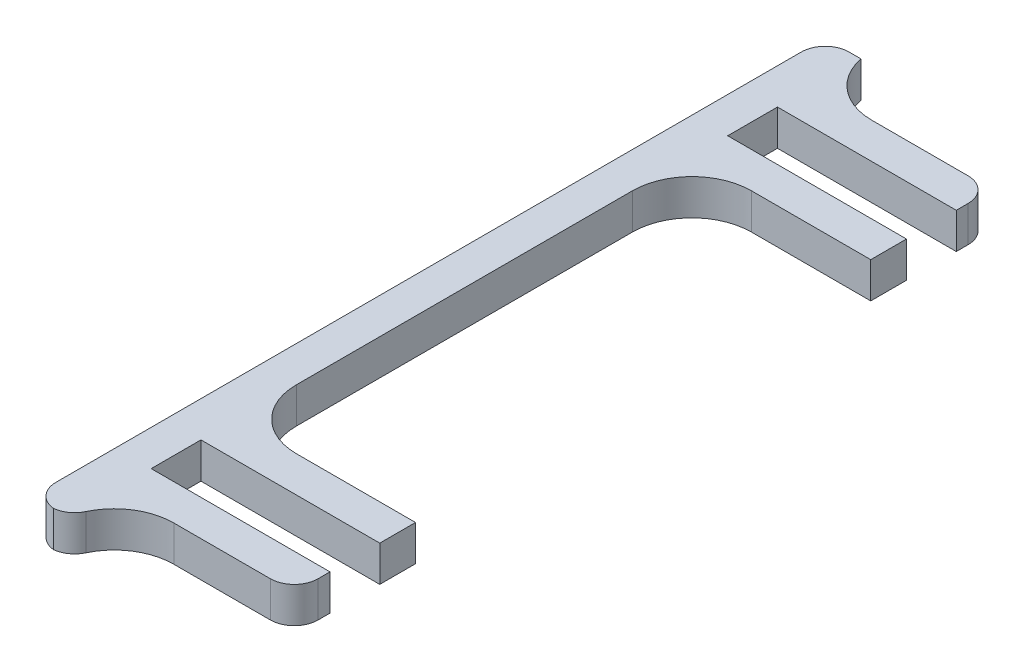
ISO-10303-21;
HEADER;
FILE_DESCRIPTION(('STEP AP214'),'2;1');
FILE_NAME('part.step','',(''),(''),'','','');
FILE_SCHEMA(('AUTOMOTIVE_DESIGN { 1 0 10303 214 1 1 1 1 }'));
ENDSEC;
DATA;
#1=APPLICATION_CONTEXT('core data for automotive mechanical design processes');
#2=APPLICATION_PROTOCOL_DEFINITION('international standard','automotive_design',2000,#1);
#3=PRODUCT_CONTEXT('',#1,'mechanical');
#4=PRODUCT('Part','Part','',(#3));
#5=PRODUCT_RELATED_PRODUCT_CATEGORY('part','',(#4));
#6=PRODUCT_DEFINITION_FORMATION('','',#4);
#7=PRODUCT_DEFINITION_CONTEXT('part definition',#1,'design');
#8=PRODUCT_DEFINITION('design','',#6,#7);
#9=PRODUCT_DEFINITION_SHAPE('','',#8);
#10=(LENGTH_UNIT() NAMED_UNIT(*) SI_UNIT(.MILLI.,.METRE.));
#11=(NAMED_UNIT(*) PLANE_ANGLE_UNIT() SI_UNIT($,.RADIAN.));
#12=(NAMED_UNIT(*) SI_UNIT($,.STERADIAN.) SOLID_ANGLE_UNIT());
#13=UNCERTAINTY_MEASURE_WITH_UNIT(LENGTH_MEASURE(1.E-05),#10,'distance_accuracy_value','');
#14=(GEOMETRIC_REPRESENTATION_CONTEXT(3) GLOBAL_UNCERTAINTY_ASSIGNED_CONTEXT((#13)) GLOBAL_UNIT_ASSIGNED_CONTEXT((#10,
#11,#12)) REPRESENTATION_CONTEXT('',''));
#15=CARTESIAN_POINT('',(0.,0.,0.));
#16=DIRECTION('',(0.,0.,1.));
#17=DIRECTION('',(1.,0.,0.));
#18=AXIS2_PLACEMENT_3D('',#15,#16,#17);
#19=CARTESIAN_POINT('',(-128.893874999704,3.,24.675));
#20=DIRECTION('',(-1.,0.,0.));
#21=DIRECTION('',(0.,0.,1.));
#22=AXIS2_PLACEMENT_3D('',#19,#20,#21);
#23=PLANE('',#22);
#24=DIRECTION('',(0.,0.,-1.));
#25=VECTOR('',#24,1.);
#26=CARTESIAN_POINT('',(-128.893874999704,3.,24.675));
#27=LINE('',#26,#25);
#28=CARTESIAN_POINT('',(-128.893874999704,3.,25.675));
#29=VERTEX_POINT('',#28);
#30=CARTESIAN_POINT('',(-128.893874999704,3.,24.675));
#31=VERTEX_POINT('',#30);
#32=EDGE_CURVE('E217',#29,#31,#27,.T.);
#33=ORIENTED_EDGE('',*,*,#32,.F.);
#34=DIRECTION('',(0.,-1.,0.));
#35=VECTOR('',#34,1.);
#36=CARTESIAN_POINT('',(-128.893874999704,3.,25.675));
#37=LINE('',#36,#35);
#38=CARTESIAN_POINT('',(-128.893874999704,0.,25.675));
#39=VERTEX_POINT('',#38);
#40=EDGE_CURVE('E300',#29,#39,#37,.T.);
#41=ORIENTED_EDGE('',*,*,#40,.T.);
#42=DIRECTION('',(0.,0.,-1.));
#43=VECTOR('',#42,1.);
#44=CARTESIAN_POINT('',(-128.893874999704,0.,24.675));
#45=LINE('',#44,#43);
#46=CARTESIAN_POINT('',(-128.893874999704,0.,24.675));
#47=VERTEX_POINT('',#46);
#48=EDGE_CURVE('E243',#39,#47,#45,.T.);
#49=ORIENTED_EDGE('',*,*,#48,.T.);
#50=DIRECTION('',(0.,-1.,0.));
#51=VECTOR('',#50,1.);
#52=CARTESIAN_POINT('',(-128.893874999704,3.,24.675));
#53=LINE('',#52,#51);
#54=EDGE_CURVE('E235',#31,#47,#53,.T.);
#55=ORIENTED_EDGE('',*,*,#54,.F.);
#56=EDGE_LOOP('',(#33,#41,#49,#55));
#57=FACE_BOUND('',#56,.T.);
#58=ADVANCED_FACE('F45',(#57),#23,.F.);
#59=CARTESIAN_POINT('',(-128.893874999704,3.,24.675));
#60=DIRECTION('',(0.,0.,1.));
#61=DIRECTION('',(1.,0.,0.));
#62=AXIS2_PLACEMENT_3D('',#59,#60,#61);
#63=PLANE('',#62);
#64=DIRECTION('',(-1.,0.,0.));
#65=VECTOR('',#64,1.);
#66=CARTESIAN_POINT('',(-128.893874999704,0.,24.675));
#67=LINE('',#66,#65);
#68=CARTESIAN_POINT('',(-143.893874999704,0.,24.675));
#69=VERTEX_POINT('',#68);
#70=EDGE_CURVE('E430',#47,#69,#67,.T.);
#71=ORIENTED_EDGE('',*,*,#70,.T.);
#72=DIRECTION('',(0.,-1.,0.));
#73=VECTOR('',#72,1.);
#74=CARTESIAN_POINT('',(-143.893874999704,3.,24.675));
#75=LINE('',#74,#73);
#76=CARTESIAN_POINT('',(-143.893874999704,3.,24.675));
#77=VERTEX_POINT('',#76);
#78=EDGE_CURVE('E237',#77,#69,#75,.T.);
#79=ORIENTED_EDGE('',*,*,#78,.F.);
#80=DIRECTION('',(-1.,0.,0.));
#81=VECTOR('',#80,1.);
#82=CARTESIAN_POINT('',(-128.893874999704,3.,24.675));
#83=LINE('',#82,#81);
#84=EDGE_CURVE('E221',#31,#77,#83,.T.);
#85=ORIENTED_EDGE('',*,*,#84,.F.);
#86=ORIENTED_EDGE('',*,*,#54,.T.);
#87=EDGE_LOOP('',(#71,#79,#85,#86));
#88=FACE_BOUND('',#87,.T.);
#89=ADVANCED_FACE('F234',(#88),#63,.F.);
#90=CARTESIAN_POINT('',(-143.893874999704,3.,20.5));
#91=DIRECTION('',(-1.,0.,0.));
#92=DIRECTION('',(0.,0.,1.));
#93=AXIS2_PLACEMENT_3D('',#90,#91,#92);
#94=PLANE('',#93);
#95=DIRECTION('',(0.,0.,-1.));
#96=VECTOR('',#95,1.);
#97=CARTESIAN_POINT('',(-143.893874999704,0.,20.5));
#98=LINE('',#97,#96);
#99=CARTESIAN_POINT('',(-143.893874999704,0.,20.5));
#100=VERTEX_POINT('',#99);
#101=EDGE_CURVE('E421',#69,#100,#98,.T.);
#102=ORIENTED_EDGE('',*,*,#101,.T.);
#103=DIRECTION('',(0.,-1.,0.));
#104=VECTOR('',#103,1.);
#105=CARTESIAN_POINT('',(-143.893874999704,3.,20.5));
#106=LINE('',#105,#104);
#107=CARTESIAN_POINT('',(-143.893874999704,3.,20.5));
#108=VERTEX_POINT('',#107);
#109=EDGE_CURVE('E252',#108,#100,#106,.T.);
#110=ORIENTED_EDGE('',*,*,#109,.F.);
#111=DIRECTION('',(0.,0.,-1.));
#112=VECTOR('',#111,1.);
#113=CARTESIAN_POINT('',(-143.893874999704,3.,20.5));
#114=LINE('',#113,#112);
#115=EDGE_CURVE('E240',#77,#108,#114,.T.);
#116=ORIENTED_EDGE('',*,*,#115,.F.);
#117=ORIENTED_EDGE('',*,*,#78,.T.);
#118=EDGE_LOOP('',(#102,#110,#116,#117));
#119=FACE_BOUND('',#118,.T.);
#120=ADVANCED_FACE('F490',(#119),#94,.F.);
#121=CARTESIAN_POINT('',(-128.893874999704,3.,20.5));
#122=DIRECTION('',(0.,0.,-1.));
#123=DIRECTION('',(-1.,0.,0.));
#124=AXIS2_PLACEMENT_3D('',#121,#122,#123);
#125=PLANE('',#124);
#126=DIRECTION('',(1.,0.,0.));
#127=VECTOR('',#126,1.);
#128=CARTESIAN_POINT('',(-128.893874999704,0.,20.5));
#129=LINE('',#128,#127);
#130=CARTESIAN_POINT('',(-128.893874999704,0.,20.5));
#131=VERTEX_POINT('',#130);
#132=EDGE_CURVE('E416',#100,#131,#129,.T.);
#133=ORIENTED_EDGE('',*,*,#132,.T.);
#134=DIRECTION('',(0.,-1.,0.));
#135=VECTOR('',#134,1.);
#136=CARTESIAN_POINT('',(-128.893874999704,3.,20.5));
#137=LINE('',#136,#135);
#138=CARTESIAN_POINT('',(-128.893874999704,3.,20.5));
#139=VERTEX_POINT('',#138);
#140=EDGE_CURVE('E405',#139,#131,#137,.T.);
#141=ORIENTED_EDGE('',*,*,#140,.F.);
#142=DIRECTION('',(1.,0.,0.));
#143=VECTOR('',#142,1.);
#144=CARTESIAN_POINT('',(-128.893874999704,3.,20.5));
#145=LINE('',#144,#143);
#146=EDGE_CURVE('E417',#108,#139,#145,.T.);
#147=ORIENTED_EDGE('',*,*,#146,.F.);
#148=ORIENTED_EDGE('',*,*,#109,.T.);
#149=EDGE_LOOP('',(#133,#141,#147,#148));
#150=FACE_BOUND('',#149,.T.);
#151=ADVANCED_FACE('F414',(#150),#125,.F.);
#152=CARTESIAN_POINT('',(-128.893874999704,3.,17.5));
#153=DIRECTION('',(-1.,0.,0.));
#154=DIRECTION('',(0.,0.,1.));
#155=AXIS2_PLACEMENT_3D('',#152,#153,#154);
#156=PLANE('',#155);
#157=DIRECTION('',(0.,0.,-1.));
#158=VECTOR('',#157,1.);
#159=CARTESIAN_POINT('',(-128.893874999704,0.,17.5));
#160=LINE('',#159,#158);
#161=CARTESIAN_POINT('',(-128.893874999704,0.,17.5));
#162=VERTEX_POINT('',#161);
#163=EDGE_CURVE('E423',#131,#162,#160,.T.);
#164=ORIENTED_EDGE('',*,*,#163,.T.);
#165=DIRECTION('',(0.,-1.,0.));
#166=VECTOR('',#165,1.);
#167=CARTESIAN_POINT('',(-128.893874999704,3.,17.5));
#168=LINE('',#167,#166);
#169=CARTESIAN_POINT('',(-128.893874999704,3.,17.5));
#170=VERTEX_POINT('',#169);
#171=EDGE_CURVE('E401',#170,#162,#168,.T.);
#172=ORIENTED_EDGE('',*,*,#171,.F.);
#173=DIRECTION('',(0.,0.,-1.));
#174=VECTOR('',#173,1.);
#175=CARTESIAN_POINT('',(-128.893874999704,3.,17.5));
#176=LINE('',#175,#174);
#177=EDGE_CURVE('E494',#139,#170,#176,.T.);
#178=ORIENTED_EDGE('',*,*,#177,.F.);
#179=ORIENTED_EDGE('',*,*,#140,.T.);
#180=EDGE_LOOP('',(#164,#172,#178,#179));
#181=FACE_BOUND('',#180,.T.);
#182=ADVANCED_FACE('F576',(#181),#156,.F.);
#183=CARTESIAN_POINT('',(-143.893874999704,3.,17.5));
#184=DIRECTION('',(0.,0.,1.));
#185=DIRECTION('',(1.,0.,0.));
#186=AXIS2_PLACEMENT_3D('',#183,#184,#185);
#187=PLANE('',#186);
#188=DIRECTION('',(-1.,0.,0.));
#189=VECTOR('',#188,1.);
#190=CARTESIAN_POINT('',(-143.893874999704,0.,17.5));
#191=LINE('',#190,#189);
#192=CARTESIAN_POINT('',(-138.893874999704,0.,17.5));
#193=VERTEX_POINT('',#192);
#194=EDGE_CURVE('E428',#162,#193,#191,.T.);
#195=ORIENTED_EDGE('',*,*,#194,.T.);
#196=DIRECTION('',(0.,-1.,0.));
#197=VECTOR('',#196,1.);
#198=CARTESIAN_POINT('',(-138.893874999704,3.,17.5));
#199=LINE('',#198,#197);
#200=CARTESIAN_POINT('',(-138.893874999704,3.,17.5));
#201=VERTEX_POINT('',#200);
#202=EDGE_CURVE('E259',#193,#201,#199,.F.);
#203=ORIENTED_EDGE('',*,*,#202,.T.);
#204=DIRECTION('',(-1.,0.,0.));
#205=VECTOR('',#204,1.);
#206=CARTESIAN_POINT('',(-143.893874999704,3.,17.5));
#207=LINE('',#206,#205);
#208=EDGE_CURVE('E499',#170,#201,#207,.T.);
#209=ORIENTED_EDGE('',*,*,#208,.F.);
#210=ORIENTED_EDGE('',*,*,#171,.T.);
#211=EDGE_LOOP('',(#195,#203,#209,#210));
#212=FACE_BOUND('',#211,.T.);
#213=ADVANCED_FACE('F572',(#212),#187,.F.);
#214=CARTESIAN_POINT('',(-143.893874999704,3.,-20.6900000000013));
#215=DIRECTION('',(-1.,0.,0.));
#216=DIRECTION('',(0.,0.,1.));
#217=AXIS2_PLACEMENT_3D('',#214,#215,#216);
#218=PLANE('',#217);
#219=DIRECTION('',(0.,0.,-1.));
#220=VECTOR('',#219,1.);
#221=CARTESIAN_POINT('',(-143.893874999704,3.,-20.6900000000013));
#222=LINE('',#221,#220);
#223=CARTESIAN_POINT('',(-143.893874999704,3.,12.5));
#224=VERTEX_POINT('',#223);
#225=CARTESIAN_POINT('',(-143.893874999704,3.,-15.6900000000013));
#226=VERTEX_POINT('',#225);
#227=EDGE_CURVE('E503',#224,#226,#222,.T.);
#228=ORIENTED_EDGE('',*,*,#227,.F.);
#229=DIRECTION('',(0.,-1.,0.));
#230=VECTOR('',#229,1.);
#231=CARTESIAN_POINT('',(-143.893874999704,0.,12.5));
#232=LINE('',#231,#230);
#233=CARTESIAN_POINT('',(-143.893874999704,0.,12.5));
#234=VERTEX_POINT('',#233);
#235=EDGE_CURVE('E250',#224,#234,#232,.T.);
#236=ORIENTED_EDGE('',*,*,#235,.T.);
#237=DIRECTION('',(0.,0.,-1.));
#238=VECTOR('',#237,1.);
#239=CARTESIAN_POINT('',(-143.893874999704,0.,-20.6900000000013));
#240=LINE('',#239,#238);
#241=CARTESIAN_POINT('',(-143.893874999704,0.,-15.6900000000013));
#242=VERTEX_POINT('',#241);
#243=EDGE_CURVE('E437',#234,#242,#240,.T.);
#244=ORIENTED_EDGE('',*,*,#243,.T.);
#245=DIRECTION('',(0.,-1.,0.));
#246=VECTOR('',#245,1.);
#247=CARTESIAN_POINT('',(-143.893874999704,3.,-15.6900000000013));
#248=LINE('',#247,#246);
#249=EDGE_CURVE('E246',#242,#226,#248,.F.);
#250=ORIENTED_EDGE('',*,*,#249,.T.);
#251=EDGE_LOOP('',(#228,#236,#244,#250));
#252=FACE_BOUND('',#251,.T.);
#253=ADVANCED_FACE('F564',(#252),#218,.F.);
#254=CARTESIAN_POINT('',(-128.893874999704,3.,-20.6900000000013));
#255=DIRECTION('',(0.,0.,-1.));
#256=DIRECTION('',(-1.,0.,0.));
#257=AXIS2_PLACEMENT_3D('',#254,#255,#256);
#258=PLANE('',#257);
#259=DIRECTION('',(1.,0.,0.));
#260=VECTOR('',#259,1.);
#261=CARTESIAN_POINT('',(-128.893874999704,3.,-20.6900000000013));
#262=LINE('',#261,#260);
#263=CARTESIAN_POINT('',(-138.893874999704,3.,-20.6900000000013));
#264=VERTEX_POINT('',#263);
#265=CARTESIAN_POINT('',(-128.893874999704,3.,-20.6900000000013));
#266=VERTEX_POINT('',#265);
#267=EDGE_CURVE('E507',#264,#266,#262,.T.);
#268=ORIENTED_EDGE('',*,*,#267,.F.);
#269=DIRECTION('',(0.,-1.,0.));
#270=VECTOR('',#269,1.);
#271=CARTESIAN_POINT('',(-138.893874999704,0.,-20.6900000000013));
#272=LINE('',#271,#270);
#273=CARTESIAN_POINT('',(-138.893874999704,0.,-20.6900000000013));
#274=VERTEX_POINT('',#273);
#275=EDGE_CURVE('E262',#264,#274,#272,.T.);
#276=ORIENTED_EDGE('',*,*,#275,.T.);
#277=DIRECTION('',(1.,0.,0.));
#278=VECTOR('',#277,1.);
#279=CARTESIAN_POINT('',(-128.893874999704,0.,-20.6900000000013));
#280=LINE('',#279,#278);
#281=CARTESIAN_POINT('',(-128.893874999704,0.,-20.6900000000013));
#282=VERTEX_POINT('',#281);
#283=EDGE_CURVE('E441',#274,#282,#280,.T.);
#284=ORIENTED_EDGE('',*,*,#283,.T.);
#285=DIRECTION('',(0.,-1.,0.));
#286=VECTOR('',#285,1.);
#287=CARTESIAN_POINT('',(-128.893874999704,3.,-20.6900000000013));
#288=LINE('',#287,#286);
#289=EDGE_CURVE('E397',#266,#282,#288,.T.);
#290=ORIENTED_EDGE('',*,*,#289,.F.);
#291=EDGE_LOOP('',(#268,#276,#284,#290));
#292=FACE_BOUND('',#291,.T.);
#293=ADVANCED_FACE('F556',(#292),#258,.F.);
#294=CARTESIAN_POINT('',(-128.893874999704,3.,-23.6900000000013));
#295=DIRECTION('',(-1.,0.,0.));
#296=DIRECTION('',(0.,0.,1.));
#297=AXIS2_PLACEMENT_3D('',#294,#295,#296);
#298=PLANE('',#297);
#299=DIRECTION('',(0.,0.,-1.));
#300=VECTOR('',#299,1.);
#301=CARTESIAN_POINT('',(-128.893874999704,0.,-23.6900000000013));
#302=LINE('',#301,#300);
#303=CARTESIAN_POINT('',(-128.893874999704,0.,-23.6900000000013));
#304=VERTEX_POINT('',#303);
#305=EDGE_CURVE('E444',#282,#304,#302,.T.);
#306=ORIENTED_EDGE('',*,*,#305,.T.);
#307=DIRECTION('',(0.,-1.,0.));
#308=VECTOR('',#307,1.);
#309=CARTESIAN_POINT('',(-128.893874999704,3.,-23.6900000000013));
#310=LINE('',#309,#308);
#311=CARTESIAN_POINT('',(-128.893874999704,3.,-23.6900000000013));
#312=VERTEX_POINT('',#311);
#313=EDGE_CURVE('E393',#312,#304,#310,.T.);
#314=ORIENTED_EDGE('',*,*,#313,.F.);
#315=DIRECTION('',(0.,0.,-1.));
#316=VECTOR('',#315,1.);
#317=CARTESIAN_POINT('',(-128.893874999704,3.,-23.6900000000013));
#318=LINE('',#317,#316);
#319=EDGE_CURVE('E510',#266,#312,#318,.T.);
#320=ORIENTED_EDGE('',*,*,#319,.F.);
#321=ORIENTED_EDGE('',*,*,#289,.T.);
#322=EDGE_LOOP('',(#306,#314,#320,#321));
#323=FACE_BOUND('',#322,.T.);
#324=ADVANCED_FACE('F550',(#323),#298,.F.);
#325=CARTESIAN_POINT('',(-143.893874999704,3.,-23.6900000000013));
#326=DIRECTION('',(0.,0.,1.));
#327=DIRECTION('',(1.,0.,0.));
#328=AXIS2_PLACEMENT_3D('',#325,#326,#327);
#329=PLANE('',#328);
#330=DIRECTION('',(-1.,0.,0.));
#331=VECTOR('',#330,1.);
#332=CARTESIAN_POINT('',(-143.893874999704,0.,-23.6900000000013));
#333=LINE('',#332,#331);
#334=CARTESIAN_POINT('',(-143.893874999704,0.,-23.6900000000013));
#335=VERTEX_POINT('',#334);
#336=EDGE_CURVE('E447',#304,#335,#333,.T.);
#337=ORIENTED_EDGE('',*,*,#336,.T.);
#338=DIRECTION('',(0.,-1.,0.));
#339=VECTOR('',#338,1.);
#340=CARTESIAN_POINT('',(-143.893874999704,3.,-23.6900000000013));
#341=LINE('',#340,#339);
#342=CARTESIAN_POINT('',(-143.893874999704,3.,-23.6900000000013));
#343=VERTEX_POINT('',#342);
#344=EDGE_CURVE('E389',#343,#335,#341,.T.);
#345=ORIENTED_EDGE('',*,*,#344,.F.);
#346=DIRECTION('',(-1.,0.,0.));
#347=VECTOR('',#346,1.);
#348=CARTESIAN_POINT('',(-143.893874999704,3.,-23.6900000000013));
#349=LINE('',#348,#347);
#350=EDGE_CURVE('E513',#312,#343,#349,.T.);
#351=ORIENTED_EDGE('',*,*,#350,.F.);
#352=ORIENTED_EDGE('',*,*,#313,.T.);
#353=EDGE_LOOP('',(#337,#345,#351,#352));
#354=FACE_BOUND('',#353,.T.);
#355=ADVANCED_FACE('F546',(#354),#329,.F.);
#356=CARTESIAN_POINT('',(-143.893874999704,3.,-27.8649999999986));
#357=DIRECTION('',(-1.,0.,0.));
#358=DIRECTION('',(0.,0.,1.));
#359=AXIS2_PLACEMENT_3D('',#356,#357,#358);
#360=PLANE('',#359);
#361=DIRECTION('',(0.,0.,-1.));
#362=VECTOR('',#361,1.);
#363=CARTESIAN_POINT('',(-143.893874999704,0.,-27.8649999999986));
#364=LINE('',#363,#362);
#365=CARTESIAN_POINT('',(-143.893874999704,0.,-27.8649999999986));
#366=VERTEX_POINT('',#365);
#367=EDGE_CURVE('E450',#335,#366,#364,.T.);
#368=ORIENTED_EDGE('',*,*,#367,.T.);
#369=DIRECTION('',(0.,-1.,0.));
#370=VECTOR('',#369,1.);
#371=CARTESIAN_POINT('',(-143.893874999704,3.,-27.8649999999986));
#372=LINE('',#371,#370);
#373=CARTESIAN_POINT('',(-143.893874999704,3.,-27.8649999999986));
#374=VERTEX_POINT('',#373);
#375=EDGE_CURVE('E385',#374,#366,#372,.T.);
#376=ORIENTED_EDGE('',*,*,#375,.F.);
#377=DIRECTION('',(0.,0.,-1.));
#378=VECTOR('',#377,1.);
#379=CARTESIAN_POINT('',(-143.893874999704,3.,-27.8649999999986));
#380=LINE('',#379,#378);
#381=EDGE_CURVE('E516',#343,#374,#380,.T.);
#382=ORIENTED_EDGE('',*,*,#381,.F.);
#383=ORIENTED_EDGE('',*,*,#344,.T.);
#384=EDGE_LOOP('',(#368,#376,#382,#383));
#385=FACE_BOUND('',#384,.T.);
#386=ADVANCED_FACE('F541',(#385),#360,.F.);
#387=CARTESIAN_POINT('',(-143.893874999704,3.,-27.8649999999986));
#388=DIRECTION('',(0.,0.,-1.));
#389=DIRECTION('',(-1.,0.,0.));
#390=AXIS2_PLACEMENT_3D('',#387,#388,#389);
#391=PLANE('',#390);
#392=DIRECTION('',(1.,0.,0.));
#393=VECTOR('',#392,1.);
#394=CARTESIAN_POINT('',(-143.893874999704,0.,-27.8649999999986));
#395=LINE('',#394,#393);
#396=CARTESIAN_POINT('',(-128.893874999704,0.,-27.8649999999986));
#397=VERTEX_POINT('',#396);
#398=EDGE_CURVE('E453',#366,#397,#395,.T.);
#399=ORIENTED_EDGE('',*,*,#398,.T.);
#400=DIRECTION('',(0.,-1.,0.));
#401=VECTOR('',#400,1.);
#402=CARTESIAN_POINT('',(-128.893874999704,3.,-27.8649999999986));
#403=LINE('',#402,#401);
#404=CARTESIAN_POINT('',(-128.893874999704,3.,-27.8649999999986));
#405=VERTEX_POINT('',#404);
#406=EDGE_CURVE('E380',#405,#397,#403,.T.);
#407=ORIENTED_EDGE('',*,*,#406,.F.);
#408=DIRECTION('',(1.,0.,0.));
#409=VECTOR('',#408,1.);
#410=CARTESIAN_POINT('',(-143.893874999704,3.,-27.8649999999986));
#411=LINE('',#410,#409);
#412=EDGE_CURVE('E519',#374,#405,#411,.T.);
#413=ORIENTED_EDGE('',*,*,#412,.F.);
#414=ORIENTED_EDGE('',*,*,#375,.T.);
#415=EDGE_LOOP('',(#399,#407,#413,#414));
#416=FACE_BOUND('',#415,.T.);
#417=ADVANCED_FACE('F535',(#416),#391,.F.);
#418=CARTESIAN_POINT('',(-128.893874999704,3.,-27.8649999999986));
#419=DIRECTION('',(-1.,0.,0.));
#420=DIRECTION('',(0.,0.,1.));
#421=AXIS2_PLACEMENT_3D('',#418,#419,#420);
#422=PLANE('',#421);
#423=DIRECTION('',(0.,0.,-1.));
#424=VECTOR('',#423,1.);
#425=CARTESIAN_POINT('',(-128.893874999704,0.,-27.8649999999986));
#426=LINE('',#425,#424);
#427=CARTESIAN_POINT('',(-128.893874999704,0.,-28.8649999999986));
#428=VERTEX_POINT('',#427);
#429=EDGE_CURVE('E456',#397,#428,#426,.T.);
#430=ORIENTED_EDGE('',*,*,#429,.T.);
#431=DIRECTION('',(0.,-1.,0.));
#432=VECTOR('',#431,1.);
#433=CARTESIAN_POINT('',(-128.893874999704,3.,-28.8649999999986));
#434=LINE('',#433,#432);
#435=CARTESIAN_POINT('',(-128.893874999704,3.,-28.8649999999986));
#436=VERTEX_POINT('',#435);
#437=EDGE_CURVE('E337',#428,#436,#434,.F.);
#438=ORIENTED_EDGE('',*,*,#437,.T.);
#439=DIRECTION('',(0.,0.,-1.));
#440=VECTOR('',#439,1.);
#441=CARTESIAN_POINT('',(-128.893874999704,3.,-27.8649999999986));
#442=LINE('',#441,#440);
#443=EDGE_CURVE('E482',#405,#436,#442,.T.);
#444=ORIENTED_EDGE('',*,*,#443,.F.);
#445=ORIENTED_EDGE('',*,*,#406,.T.);
#446=EDGE_LOOP('',(#430,#438,#444,#445));
#447=FACE_BOUND('',#446,.T.);
#448=ADVANCED_FACE('F533',(#447),#422,.F.);
#449=CARTESIAN_POINT('',(-128.893874999704,3.,-30.8649999999986));
#450=DIRECTION('',(0.,0.,1.));
#451=DIRECTION('',(1.,0.,0.));
#452=AXIS2_PLACEMENT_3D('',#449,#450,#451);
#453=PLANE('',#452);
#454=DIRECTION('',(-1.,0.,0.));
#455=VECTOR('',#454,1.);
#456=CARTESIAN_POINT('',(-128.893874999704,3.,-30.8649999999986));
#457=LINE('',#456,#455);
#458=CARTESIAN_POINT('',(-130.893874999704,3.,-30.8649999999986));
#459=VERTEX_POINT('',#458);
#460=CARTESIAN_POINT('',(-138.994895514138,3.,-30.8649999999986));
#461=VERTEX_POINT('',#460);
#462=EDGE_CURVE('E473',#459,#461,#457,.T.);
#463=ORIENTED_EDGE('',*,*,#462,.F.);
#464=DIRECTION('',(0.,-1.,0.));
#465=VECTOR('',#464,1.);
#466=CARTESIAN_POINT('',(-130.893874999704,3.,-30.8649999999986));
#467=LINE('',#466,#465);
#468=CARTESIAN_POINT('',(-130.893874999704,0.,-30.8649999999986));
#469=VERTEX_POINT('',#468);
#470=EDGE_CURVE('E333',#459,#469,#467,.T.);
#471=ORIENTED_EDGE('',*,*,#470,.T.);
#472=DIRECTION('',(-1.,0.,0.));
#473=VECTOR('',#472,1.);
#474=CARTESIAN_POINT('',(-128.893874999704,0.,-30.8649999999986));
#475=LINE('',#474,#473);
#476=CARTESIAN_POINT('',(-138.994895514138,0.,-30.8649999999986));
#477=VERTEX_POINT('',#476);
#478=EDGE_CURVE('E372',#469,#477,#475,.T.);
#479=ORIENTED_EDGE('',*,*,#478,.T.);
#480=DIRECTION('',(0.,1.,0.));
#481=VECTOR('',#480,1.);
#482=CARTESIAN_POINT('',(-138.994895514138,3.,-30.8649999999986));
#483=LINE('',#482,#481);
#484=EDGE_CURVE('E266',#477,#461,#483,.T.);
#485=ORIENTED_EDGE('',*,*,#484,.T.);
#486=EDGE_LOOP('',(#463,#471,#479,#485));
#487=FACE_BOUND('',#486,.T.);
#488=ADVANCED_FACE('F463',(#487),#453,.F.);
#489=CARTESIAN_POINT('',(-146.893874999704,3.,-34.8649999999986));
#490=DIRECTION('',(0.,0.,1.));
#491=DIRECTION('',(1.,0.,0.));
#492=AXIS2_PLACEMENT_3D('',#489,#490,#491);
#493=PLANE('',#492);
#494=DIRECTION('',(-1.,0.,0.));
#495=VECTOR('',#494,1.);
#496=CARTESIAN_POINT('',(-146.893874999704,0.,-34.8649999999986));
#497=LINE('',#496,#495);
#498=CARTESIAN_POINT('',(-143.893874999704,0.,-34.8649999999986));
#499=VERTEX_POINT('',#498);
#500=CARTESIAN_POINT('',(-144.893874999704,0.,-34.8649999999986));
#501=VERTEX_POINT('',#500);
#502=EDGE_CURVE('E366',#499,#501,#497,.T.);
#503=ORIENTED_EDGE('',*,*,#502,.T.);
#504=DIRECTION('',(0.,-1.,0.));
#505=VECTOR('',#504,1.);
#506=CARTESIAN_POINT('',(-144.893874999704,3.,-34.8649999999986));
#507=LINE('',#506,#505);
#508=CARTESIAN_POINT('',(-144.893874999704,3.,-34.8649999999986));
#509=VERTEX_POINT('',#508);
#510=EDGE_CURVE('E11',#501,#509,#507,.F.);
#511=ORIENTED_EDGE('',*,*,#510,.T.);
#512=DIRECTION('',(-1.,0.,0.));
#513=VECTOR('',#512,1.);
#514=CARTESIAN_POINT('',(-146.893874999704,3.,-34.8649999999986));
#515=LINE('',#514,#513);
#516=CARTESIAN_POINT('',(-143.893874999704,3.,-34.8649999999986));
#517=VERTEX_POINT('',#516);
#518=EDGE_CURVE('E472',#517,#509,#515,.T.);
#519=ORIENTED_EDGE('',*,*,#518,.F.);
#520=DIRECTION('',(0.,-1.,0.));
#521=VECTOR('',#520,1.);
#522=CARTESIAN_POINT('',(-143.893874999704,3.,-34.8649999999986));
#523=LINE('',#522,#521);
#524=EDGE_CURVE('E376',#517,#499,#523,.T.);
#525=ORIENTED_EDGE('',*,*,#524,.T.);
#526=EDGE_LOOP('',(#503,#511,#519,#525));
#527=FACE_BOUND('',#526,.T.);
#528=ADVANCED_FACE('F475',(#527),#493,.F.);
#529=CARTESIAN_POINT('',(-146.893874999704,3.,31.675));
#530=DIRECTION('',(1.,0.,0.));
#531=DIRECTION('',(0.,0.,-1.));
#532=AXIS2_PLACEMENT_3D('',#529,#530,#531);
#533=PLANE('',#532);
#534=DIRECTION('',(0.,0.,1.));
#535=VECTOR('',#534,1.);
#536=CARTESIAN_POINT('',(-146.893874999704,3.,31.675));
#537=LINE('',#536,#535);
#538=CARTESIAN_POINT('',(-146.893874999704,3.,-32.8649999999986));
#539=VERTEX_POINT('',#538);
#540=CARTESIAN_POINT('',(-146.893874999704,3.,29.675));
#541=VERTEX_POINT('',#540);
#542=EDGE_CURVE('E357',#539,#541,#537,.T.);
#543=ORIENTED_EDGE('',*,*,#542,.F.);
#544=DIRECTION('',(0.,-1.,0.));
#545=VECTOR('',#544,1.);
#546=CARTESIAN_POINT('',(-146.893874999704,3.,-32.8649999999986));
#547=LINE('',#546,#545);
#548=CARTESIAN_POINT('',(-146.893874999704,0.,-32.8649999999986));
#549=VERTEX_POINT('',#548);
#550=EDGE_CURVE('E55',#539,#549,#547,.T.);
#551=ORIENTED_EDGE('',*,*,#550,.T.);
#552=DIRECTION('',(0.,0.,1.));
#553=VECTOR('',#552,1.);
#554=CARTESIAN_POINT('',(-146.893874999704,0.,31.675));
#555=LINE('',#554,#553);
#556=CARTESIAN_POINT('',(-146.893874999704,0.,29.675));
#557=VERTEX_POINT('',#556);
#558=EDGE_CURVE('E355',#549,#557,#555,.T.);
#559=ORIENTED_EDGE('',*,*,#558,.T.);
#560=DIRECTION('',(0.,-1.,0.));
#561=VECTOR('',#560,1.);
#562=CARTESIAN_POINT('',(-146.893874999704,3.,29.675));
#563=LINE('',#562,#561);
#564=EDGE_CURVE('E344',#557,#541,#563,.F.);
#565=ORIENTED_EDGE('',*,*,#564,.T.);
#566=EDGE_LOOP('',(#543,#551,#559,#565));
#567=FACE_BOUND('',#566,.T.);
#568=ADVANCED_FACE('F354',(#567),#533,.F.);
#569=CARTESIAN_POINT('',(-128.893874999704,3.,27.675));
#570=DIRECTION('',(0.,0.,-1.));
#571=DIRECTION('',(-1.,0.,0.));
#572=AXIS2_PLACEMENT_3D('',#569,#570,#571);
#573=PLANE('',#572);
#574=DIRECTION('',(1.,0.,0.));
#575=VECTOR('',#574,1.);
#576=CARTESIAN_POINT('',(-128.893874999704,0.,27.675));
#577=LINE('',#576,#575);
#578=CARTESIAN_POINT('',(-138.994895514138,0.,27.675));
#579=VERTEX_POINT('',#578);
#580=CARTESIAN_POINT('',(-130.893874999704,0.,27.675));
#581=VERTEX_POINT('',#580);
#582=EDGE_CURVE('E230',#579,#581,#577,.T.);
#583=ORIENTED_EDGE('',*,*,#582,.T.);
#584=DIRECTION('',(0.,-1.,0.));
#585=VECTOR('',#584,1.);
#586=CARTESIAN_POINT('',(-130.893874999704,3.,27.675));
#587=LINE('',#586,#585);
#588=CARTESIAN_POINT('',(-130.893874999704,3.,27.675));
#589=VERTEX_POINT('',#588);
#590=EDGE_CURVE('E318',#581,#589,#587,.F.);
#591=ORIENTED_EDGE('',*,*,#590,.T.);
#592=DIRECTION('',(1.,0.,0.));
#593=VECTOR('',#592,1.);
#594=CARTESIAN_POINT('',(-128.893874999704,3.,27.675));
#595=LINE('',#594,#593);
#596=CARTESIAN_POINT('',(-138.994895514138,3.,27.675));
#597=VERTEX_POINT('',#596);
#598=EDGE_CURVE('E381',#597,#589,#595,.T.);
#599=ORIENTED_EDGE('',*,*,#598,.F.);
#600=DIRECTION('',(0.,-1.,0.));
#601=VECTOR('',#600,1.);
#602=CARTESIAN_POINT('',(-138.994895514138,3.,27.675));
#603=LINE('',#602,#601);
#604=EDGE_CURVE('E270',#597,#579,#603,.T.);
#605=ORIENTED_EDGE('',*,*,#604,.T.);
#606=EDGE_LOOP('',(#583,#591,#599,#605));
#607=FACE_BOUND('',#606,.T.);
#608=ADVANCED_FACE('F624',(#607),#573,.F.);
#609=CARTESIAN_POINT('',(0.,3.,0.));
#610=DIRECTION('',(0.,-1.,0.));
#611=DIRECTION('',(0.,0.,-1.));
#612=AXIS2_PLACEMENT_3D('',#609,#610,#611);
#613=PLANE('',#612);
#614=ORIENTED_EDGE('',*,*,#598,.T.);
#615=CARTESIAN_POINT('',(-130.893874999704,3.,25.675));
#616=DIRECTION('',(0.,-1.,0.));
#617=DIRECTION('',(0.,0.,-1.));
#618=AXIS2_PLACEMENT_3D('',#615,#616,#617);
#619=CIRCLE('',#618,2.);
#620=EDGE_CURVE('E224',#589,#29,#619,.F.);
#621=ORIENTED_EDGE('',*,*,#620,.T.);
#622=ORIENTED_EDGE('',*,*,#32,.T.);
#623=ORIENTED_EDGE('',*,*,#84,.T.);
#624=ORIENTED_EDGE('',*,*,#115,.T.);
#625=ORIENTED_EDGE('',*,*,#146,.T.);
#626=ORIENTED_EDGE('',*,*,#177,.T.);
#627=ORIENTED_EDGE('',*,*,#208,.T.);
#628=CARTESIAN_POINT('',(-138.893874999704,3.,12.5));
#629=DIRECTION('',(0.,-1.,0.));
#630=DIRECTION('',(0.,0.,-1.));
#631=AXIS2_PLACEMENT_3D('',#628,#629,#630);
#632=CIRCLE('',#631,5.);
#633=EDGE_CURVE('E277',#201,#224,#632,.T.);
#634=ORIENTED_EDGE('',*,*,#633,.T.);
#635=ORIENTED_EDGE('',*,*,#227,.T.);
#636=CARTESIAN_POINT('',(-138.893874999704,3.,-15.6900000000013));
#637=DIRECTION('',(0.,-1.,0.));
#638=DIRECTION('',(0.,0.,-1.));
#639=AXIS2_PLACEMENT_3D('',#636,#637,#638);
#640=CIRCLE('',#639,5.);
#641=EDGE_CURVE('E283',#226,#264,#640,.T.);
#642=ORIENTED_EDGE('',*,*,#641,.T.);
#643=ORIENTED_EDGE('',*,*,#267,.T.);
#644=ORIENTED_EDGE('',*,*,#319,.T.);
#645=ORIENTED_EDGE('',*,*,#350,.T.);
#646=ORIENTED_EDGE('',*,*,#381,.T.);
#647=ORIENTED_EDGE('',*,*,#412,.T.);
#648=ORIENTED_EDGE('',*,*,#443,.T.);
#649=CARTESIAN_POINT('',(-130.893874999704,3.,-28.8649999999986));
#650=DIRECTION('',(0.,-1.,0.));
#651=DIRECTION('',(0.,0.,-1.));
#652=AXIS2_PLACEMENT_3D('',#649,#650,#651);
#653=CIRCLE('',#652,2.);
#654=EDGE_CURVE('E328',#436,#459,#653,.F.);
#655=ORIENTED_EDGE('',*,*,#654,.T.);
#656=ORIENTED_EDGE('',*,*,#462,.T.);
#657=CARTESIAN_POINT('',(-138.994895514138,3.,-35.8649999999986));
#658=DIRECTION('',(0.,-1.,0.));
#659=DIRECTION('',(0.,0.,-1.));
#660=AXIS2_PLACEMENT_3D('',#657,#658,#659);
#661=CIRCLE('',#660,5.);
#662=EDGE_CURVE('E290',#461,#517,#661,.T.);
#663=ORIENTED_EDGE('',*,*,#662,.T.);
#664=ORIENTED_EDGE('',*,*,#518,.T.);
#665=CARTESIAN_POINT('',(-144.893874999704,3.,-32.8649999999986));
#666=DIRECTION('',(0.,-1.,0.));
#667=DIRECTION('',(0.,0.,-1.));
#668=AXIS2_PLACEMENT_3D('',#665,#666,#667);
#669=CIRCLE('',#668,2.);
#670=EDGE_CURVE('E325',#509,#539,#669,.F.);
#671=ORIENTED_EDGE('',*,*,#670,.T.);
#672=ORIENTED_EDGE('',*,*,#542,.T.);
#673=CARTESIAN_POINT('',(-144.893874999704,3.,29.675));
#674=DIRECTION('',(0.,-1.,0.));
#675=DIRECTION('',(0.,0.,-1.));
#676=AXIS2_PLACEMENT_3D('',#673,#674,#675);
#677=CIRCLE('',#676,2.);
#678=CARTESIAN_POINT('',(-145.10666291709,3.,31.6636481091975));
#679=VERTEX_POINT('',#678);
#680=EDGE_CURVE('E62',#541,#679,#677,.F.);
#681=ORIENTED_EDGE('',*,*,#680,.T.);
#682=CARTESIAN_POINT('',(-145.319450834475,3.,29.675));
#683=DIRECTION('',(0.,-1.,0.));
#684=DIRECTION('',(0.,0.,-1.));
#685=AXIS2_PLACEMENT_3D('',#682,#683,#684);
#686=CIRCLE('',#685,2.);
#687=CARTESIAN_POINT('',(-143.512435028664,3.,30.5321428571429));
#688=VERTEX_POINT('',#687);
#689=EDGE_CURVE('E67',#679,#688,#686,.F.);
#690=ORIENTED_EDGE('',*,*,#689,.T.);
#691=CARTESIAN_POINT('',(-138.994895514138,3.,32.675));
#692=DIRECTION('',(0.,-1.,0.));
#693=DIRECTION('',(0.,0.,-1.));
#694=AXIS2_PLACEMENT_3D('',#691,#692,#693);
#695=CIRCLE('',#694,5.);
#696=EDGE_CURVE('E297',#688,#597,#695,.T.);
#697=ORIENTED_EDGE('',*,*,#696,.T.);
#698=EDGE_LOOP('',(#614,#621,#622,#623,#624,#625,#626,#627,#634,#635,#642,#643,#644,#645,#646,
#647,#648,#655,#656,#663,#664,#671,#672,#681,#690,#697));
#699=FACE_BOUND('',#698,.T.);
#700=ADVANCED_FACE('F220',(#699),#613,.F.);
#701=CARTESIAN_POINT('',(0.,0.,0.));
#702=DIRECTION('',(0.,-1.,0.));
#703=DIRECTION('',(0.,0.,-1.));
#704=AXIS2_PLACEMENT_3D('',#701,#702,#703);
#705=PLANE('',#704);
#706=ORIENTED_EDGE('',*,*,#48,.F.);
#707=CARTESIAN_POINT('',(-130.893874999704,0.,25.675));
#708=DIRECTION('',(0.,-1.,0.));
#709=DIRECTION('',(0.,0.,-1.));
#710=AXIS2_PLACEMENT_3D('',#707,#708,#709);
#711=CIRCLE('',#710,2.);
#712=EDGE_CURVE('E315',#39,#581,#711,.T.);
#713=ORIENTED_EDGE('',*,*,#712,.T.);
#714=ORIENTED_EDGE('',*,*,#582,.F.);
#715=CARTESIAN_POINT('',(-138.994895514138,0.,32.675));
#716=DIRECTION('',(0.,-1.,0.));
#717=DIRECTION('',(0.,0.,-1.));
#718=AXIS2_PLACEMENT_3D('',#715,#716,#717);
#719=CIRCLE('',#718,5.);
#720=CARTESIAN_POINT('',(-143.512435028664,0.,30.5321428571429));
#721=VERTEX_POINT('',#720);
#722=EDGE_CURVE('E293',#579,#721,#719,.F.);
#723=ORIENTED_EDGE('',*,*,#722,.T.);
#724=CARTESIAN_POINT('',(-145.319450834475,0.,29.675));
#725=DIRECTION('',(0.,-1.,0.));
#726=DIRECTION('',(0.,0.,-1.));
#727=AXIS2_PLACEMENT_3D('',#724,#725,#726);
#728=CIRCLE('',#727,2.);
#729=CARTESIAN_POINT('',(-145.10666291709,0.,31.6636481091975));
#730=VERTEX_POINT('',#729);
#731=EDGE_CURVE('E306',#721,#730,#728,.T.);
#732=ORIENTED_EDGE('',*,*,#731,.T.);
#733=CARTESIAN_POINT('',(-144.893874999704,0.,29.675));
#734=DIRECTION('',(0.,-1.,0.));
#735=DIRECTION('',(0.,0.,-1.));
#736=AXIS2_PLACEMENT_3D('',#733,#734,#735);
#737=CIRCLE('',#736,2.);
#738=EDGE_CURVE('E303',#730,#557,#737,.T.);
#739=ORIENTED_EDGE('',*,*,#738,.T.);
#740=ORIENTED_EDGE('',*,*,#558,.F.);
#741=CARTESIAN_POINT('',(-144.893874999704,0.,-32.8649999999986));
#742=DIRECTION('',(0.,-1.,0.));
#743=DIRECTION('',(0.,0.,-1.));
#744=AXIS2_PLACEMENT_3D('',#741,#742,#743);
#745=CIRCLE('',#744,2.);
#746=EDGE_CURVE('E309',#549,#501,#745,.T.);
#747=ORIENTED_EDGE('',*,*,#746,.T.);
#748=ORIENTED_EDGE('',*,*,#502,.F.);
#749=CARTESIAN_POINT('',(-138.994895514138,0.,-35.8649999999986));
#750=DIRECTION('',(0.,-1.,0.));
#751=DIRECTION('',(0.,0.,-1.));
#752=AXIS2_PLACEMENT_3D('',#749,#750,#751);
#753=CIRCLE('',#752,5.);
#754=EDGE_CURVE('E286',#499,#477,#753,.F.);
#755=ORIENTED_EDGE('',*,*,#754,.T.);
#756=ORIENTED_EDGE('',*,*,#478,.F.);
#757=CARTESIAN_POINT('',(-130.893874999704,0.,-28.8649999999986));
#758=DIRECTION('',(0.,-1.,0.));
#759=DIRECTION('',(0.,0.,-1.));
#760=AXIS2_PLACEMENT_3D('',#757,#758,#759);
#761=CIRCLE('',#760,2.);
#762=EDGE_CURVE('E312',#469,#428,#761,.T.);
#763=ORIENTED_EDGE('',*,*,#762,.T.);
#764=ORIENTED_EDGE('',*,*,#429,.F.);
#765=ORIENTED_EDGE('',*,*,#398,.F.);
#766=ORIENTED_EDGE('',*,*,#367,.F.);
#767=ORIENTED_EDGE('',*,*,#336,.F.);
#768=ORIENTED_EDGE('',*,*,#305,.F.);
#769=ORIENTED_EDGE('',*,*,#283,.F.);
#770=CARTESIAN_POINT('',(-138.893874999704,0.,-15.6900000000013));
#771=DIRECTION('',(0.,-1.,0.));
#772=DIRECTION('',(0.,0.,-1.));
#773=AXIS2_PLACEMENT_3D('',#770,#771,#772);
#774=CIRCLE('',#773,5.);
#775=EDGE_CURVE('E280',#274,#242,#774,.F.);
#776=ORIENTED_EDGE('',*,*,#775,.T.);
#777=ORIENTED_EDGE('',*,*,#243,.F.);
#778=CARTESIAN_POINT('',(-138.893874999704,0.,12.5));
#779=DIRECTION('',(0.,-1.,0.));
#780=DIRECTION('',(0.,0.,-1.));
#781=AXIS2_PLACEMENT_3D('',#778,#779,#780);
#782=CIRCLE('',#781,5.);
#783=EDGE_CURVE('E274',#234,#193,#782,.F.);
#784=ORIENTED_EDGE('',*,*,#783,.T.);
#785=ORIENTED_EDGE('',*,*,#194,.F.);
#786=ORIENTED_EDGE('',*,*,#163,.F.);
#787=ORIENTED_EDGE('',*,*,#132,.F.);
#788=ORIENTED_EDGE('',*,*,#101,.F.);
#789=ORIENTED_EDGE('',*,*,#70,.F.);
#790=EDGE_LOOP('',(#706,#713,#714,#723,#732,#739,#740,#747,#748,#755,#756,#763,#764,#765,#766,
#767,#768,#769,#776,#777,#784,#785,#786,#787,#788,#789));
#791=FACE_BOUND('',#790,.T.);
#792=ADVANCED_FACE('F361',(#791),#705,.T.);
#793=CARTESIAN_POINT('',(-138.893874999704,3.,12.5));
#794=DIRECTION('',(0.,1.,0.));
#795=DIRECTION('',(0.,0.,1.));
#796=AXIS2_PLACEMENT_3D('',#793,#794,#795);
#797=CYLINDRICAL_SURFACE('',#796,5.);
#798=ORIENTED_EDGE('',*,*,#633,.F.);
#799=ORIENTED_EDGE('',*,*,#202,.F.);
#800=ORIENTED_EDGE('',*,*,#783,.F.);
#801=ORIENTED_EDGE('',*,*,#235,.F.);
#802=EDGE_LOOP('',(#798,#799,#800,#801));
#803=FACE_BOUND('',#802,.T.);
#804=ADVANCED_FACE('F570',(#803),#797,.F.);
#805=CARTESIAN_POINT('',(-138.893874999704,3.,-15.6900000000013));
#806=DIRECTION('',(0.,1.,0.));
#807=DIRECTION('',(0.,0.,1.));
#808=AXIS2_PLACEMENT_3D('',#805,#806,#807);
#809=CYLINDRICAL_SURFACE('',#808,5.);
#810=ORIENTED_EDGE('',*,*,#641,.F.);
#811=ORIENTED_EDGE('',*,*,#249,.F.);
#812=ORIENTED_EDGE('',*,*,#775,.F.);
#813=ORIENTED_EDGE('',*,*,#275,.F.);
#814=EDGE_LOOP('',(#810,#811,#812,#813));
#815=FACE_BOUND('',#814,.T.);
#816=ADVANCED_FACE('F560',(#815),#809,.F.);
#817=CARTESIAN_POINT('',(-138.994895514138,3.,-35.8649999999986));
#818=DIRECTION('',(0.,1.,0.));
#819=DIRECTION('',(0.,0.,1.));
#820=AXIS2_PLACEMENT_3D('',#817,#818,#819);
#821=CYLINDRICAL_SURFACE('',#820,5.);
#822=ORIENTED_EDGE('',*,*,#662,.F.);
#823=ORIENTED_EDGE('',*,*,#484,.F.);
#824=ORIENTED_EDGE('',*,*,#754,.F.);
#825=ORIENTED_EDGE('',*,*,#524,.F.);
#826=EDGE_LOOP('',(#822,#823,#824,#825));
#827=FACE_BOUND('',#826,.T.);
#828=ADVANCED_FACE('F469',(#827),#821,.F.);
#829=CARTESIAN_POINT('',(-138.994895514138,3.,32.675));
#830=DIRECTION('',(0.,-1.,0.));
#831=DIRECTION('',(0.,0.,-1.));
#832=AXIS2_PLACEMENT_3D('',#829,#830,#831);
#833=CYLINDRICAL_SURFACE('',#832,5.);
#834=ORIENTED_EDGE('',*,*,#696,.F.);
#835=DIRECTION('',(0.,-1.,0.));
#836=VECTOR('',#835,1.);
#837=CARTESIAN_POINT('',(-143.512435028664,3.,30.5321428571429));
#838=LINE('',#837,#836);
#839=EDGE_CURVE('E340',#688,#721,#838,.T.);
#840=ORIENTED_EDGE('',*,*,#839,.T.);
#841=ORIENTED_EDGE('',*,*,#722,.F.);
#842=ORIENTED_EDGE('',*,*,#604,.F.);
#843=EDGE_LOOP('',(#834,#840,#841,#842));
#844=FACE_BOUND('',#843,.T.);
#845=ADVANCED_FACE('F599',(#844),#833,.F.);
#846=CARTESIAN_POINT('',(-130.893874999704,3.,25.675));
#847=DIRECTION('',(0.,-1.,0.));
#848=DIRECTION('',(0.,0.,-1.));
#849=AXIS2_PLACEMENT_3D('',#846,#847,#848);
#850=CYLINDRICAL_SURFACE('',#849,2.);
#851=ORIENTED_EDGE('',*,*,#620,.F.);
#852=ORIENTED_EDGE('',*,*,#590,.F.);
#853=ORIENTED_EDGE('',*,*,#712,.F.);
#854=ORIENTED_EDGE('',*,*,#40,.F.);
#855=EDGE_LOOP('',(#851,#852,#853,#854));
#856=FACE_BOUND('',#855,.T.);
#857=ADVANCED_FACE('F602',(#856),#850,.T.);
#858=CARTESIAN_POINT('',(-130.893874999704,3.,-28.8649999999986));
#859=DIRECTION('',(0.,-1.,0.));
#860=DIRECTION('',(0.,0.,-1.));
#861=AXIS2_PLACEMENT_3D('',#858,#859,#860);
#862=CYLINDRICAL_SURFACE('',#861,2.);
#863=ORIENTED_EDGE('',*,*,#654,.F.);
#864=ORIENTED_EDGE('',*,*,#437,.F.);
#865=ORIENTED_EDGE('',*,*,#762,.F.);
#866=ORIENTED_EDGE('',*,*,#470,.F.);
#867=EDGE_LOOP('',(#863,#864,#865,#866));
#868=FACE_BOUND('',#867,.T.);
#869=ADVANCED_FACE('F530',(#868),#862,.T.);
#870=CARTESIAN_POINT('',(-144.893874999704,3.,29.675));
#871=DIRECTION('',(0.,-1.,0.));
#872=DIRECTION('',(0.,0.,-1.));
#873=AXIS2_PLACEMENT_3D('',#870,#871,#872);
#874=CYLINDRICAL_SURFACE('',#873,2.);
#875=DIRECTION('',(0.,-1.,0.));
#876=VECTOR('',#875,1.);
#877=CARTESIAN_POINT('',(-145.10666291709,1.5,31.6636481091975));
#878=LINE('',#877,#876);
#879=EDGE_CURVE('E49',#679,#730,#878,.T.);
#880=ORIENTED_EDGE('',*,*,#879,.F.);
#881=ORIENTED_EDGE('',*,*,#680,.F.);
#882=ORIENTED_EDGE('',*,*,#564,.F.);
#883=ORIENTED_EDGE('',*,*,#738,.F.);
#884=EDGE_LOOP('',(#880,#881,#882,#883));
#885=FACE_BOUND('',#884,.T.);
#886=ADVANCED_FACE('F609',(#885),#874,.T.);
#887=CARTESIAN_POINT('',(-145.319450834475,3.,29.675));
#888=DIRECTION('',(0.,-1.,0.));
#889=DIRECTION('',(0.,0.,-1.));
#890=AXIS2_PLACEMENT_3D('',#887,#888,#889);
#891=CYLINDRICAL_SURFACE('',#890,2.);
#892=ORIENTED_EDGE('',*,*,#689,.F.);
#893=ORIENTED_EDGE('',*,*,#879,.T.);
#894=ORIENTED_EDGE('',*,*,#731,.F.);
#895=ORIENTED_EDGE('',*,*,#839,.F.);
#896=EDGE_LOOP('',(#892,#893,#894,#895));
#897=FACE_BOUND('',#896,.T.);
#898=ADVANCED_FACE('F610',(#897),#891,.T.);
#899=CARTESIAN_POINT('',(-144.893874999704,3.,-32.8649999999986));
#900=DIRECTION('',(0.,-1.,0.));
#901=DIRECTION('',(0.,0.,-1.));
#902=AXIS2_PLACEMENT_3D('',#899,#900,#901);
#903=CYLINDRICAL_SURFACE('',#902,2.);
#904=ORIENTED_EDGE('',*,*,#670,.F.);
#905=ORIENTED_EDGE('',*,*,#510,.F.);
#906=ORIENTED_EDGE('',*,*,#746,.F.);
#907=ORIENTED_EDGE('',*,*,#550,.F.);
#908=EDGE_LOOP('',(#904,#905,#906,#907));
#909=FACE_BOUND('',#908,.T.);
#910=ADVANCED_FACE('F47',(#909),#903,.T.);
#911=CLOSED_SHELL('',(#58,#89,#120,#151,#182,#213,#253,#293,#324,#355,#386,#417,#448,#488,#528,
#568,#608,#700,#792,#804,#816,#828,#845,#857,#869,#886,#898,#910));
#912=MANIFOLD_SOLID_BREP('B2',#911);
#913=ADVANCED_BREP_SHAPE_REPRESENTATION('',(#18,#912),#14);
#914=SHAPE_DEFINITION_REPRESENTATION(#9,#913);
ENDSEC;
END-ISO-10303-21;
